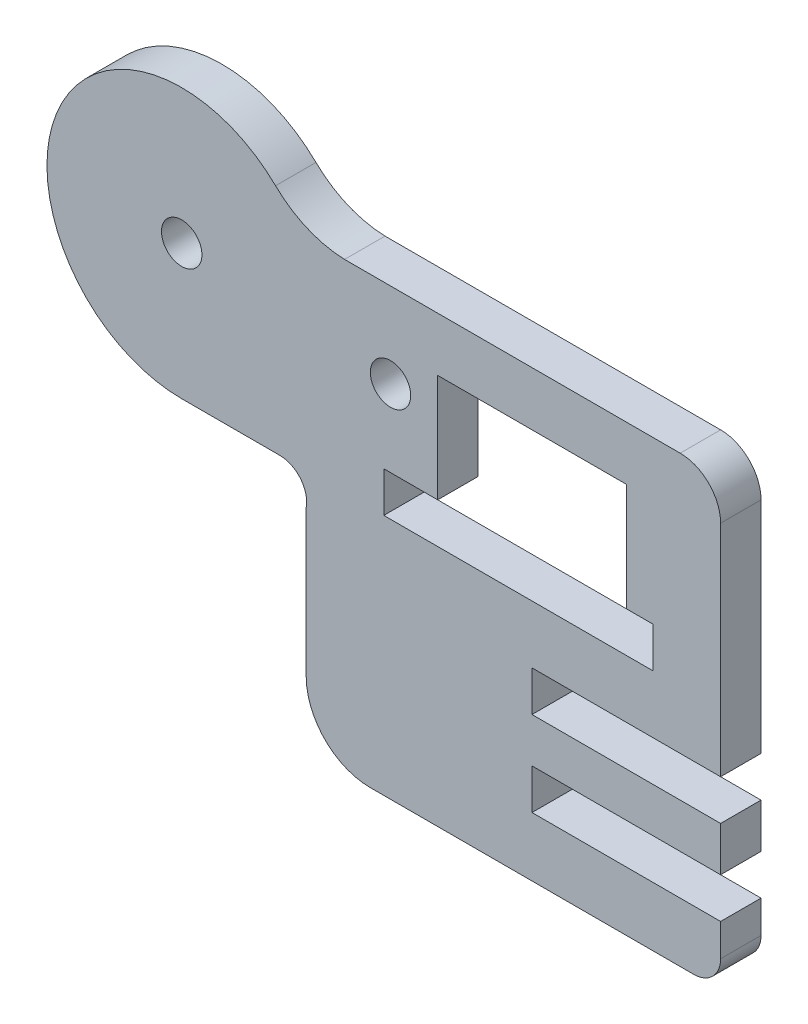
ISO-10303-21;
HEADER;
FILE_DESCRIPTION(('STEP AP214'),'2;1');
FILE_NAME('part.step','',(''),(''),'','','');
FILE_SCHEMA(('AUTOMOTIVE_DESIGN { 1 0 10303 214 1 1 1 1 }'));
ENDSEC;
DATA;
#1=APPLICATION_CONTEXT('core data for automotive mechanical design processes');
#2=APPLICATION_PROTOCOL_DEFINITION('international standard','automotive_design',2000,#1);
#3=PRODUCT_CONTEXT('',#1,'mechanical');
#4=PRODUCT('Part','Part','',(#3));
#5=PRODUCT_RELATED_PRODUCT_CATEGORY('part','',(#4));
#6=PRODUCT_DEFINITION_FORMATION('','',#4);
#7=PRODUCT_DEFINITION_CONTEXT('part definition',#1,'design');
#8=PRODUCT_DEFINITION('design','',#6,#7);
#9=PRODUCT_DEFINITION_SHAPE('','',#8);
#10=(LENGTH_UNIT() NAMED_UNIT(*) SI_UNIT(.MILLI.,.METRE.));
#11=(NAMED_UNIT(*) PLANE_ANGLE_UNIT() SI_UNIT($,.RADIAN.));
#12=(NAMED_UNIT(*) SI_UNIT($,.STERADIAN.) SOLID_ANGLE_UNIT());
#13=UNCERTAINTY_MEASURE_WITH_UNIT(LENGTH_MEASURE(1.E-05),#10,'distance_accuracy_value','');
#14=(GEOMETRIC_REPRESENTATION_CONTEXT(3) GLOBAL_UNCERTAINTY_ASSIGNED_CONTEXT((#13)) GLOBAL_UNIT_ASSIGNED_CONTEXT((#10,
#11,#12)) REPRESENTATION_CONTEXT('',''));
#15=CARTESIAN_POINT('',(0.,0.,0.));
#16=DIRECTION('',(0.,0.,1.));
#17=DIRECTION('',(1.,0.,0.));
#18=AXIS2_PLACEMENT_3D('',#15,#16,#17);
#19=CARTESIAN_POINT('',(5.27058823529409,-8.66843192746516,0.));
#20=DIRECTION('',(0.,1.,0.));
#21=DIRECTION('',(0.,0.,1.));
#22=AXIS2_PLACEMENT_3D('',#19,#20,#21);
#23=PLANE('',#22);
#24=DIRECTION('',(-1.,0.,0.));
#25=VECTOR('',#24,1.);
#26=CARTESIAN_POINT('',(5.27058823529409,-8.66843192746516,3.));
#27=LINE('',#26,#25);
#28=CARTESIAN_POINT('',(5.27058823529409,-8.66843192746516,3.));
#29=VERTEX_POINT('',#28);
#30=CARTESIAN_POINT('',(3.27058823529409,-8.66843192746516,3.));
#31=VERTEX_POINT('',#30);
#32=EDGE_CURVE('E297',#29,#31,#27,.T.);
#33=ORIENTED_EDGE('',*,*,#32,.T.);
#34=DIRECTION('',(0.,0.,1.));
#35=VECTOR('',#34,1.);
#36=CARTESIAN_POINT('',(3.27058823529409,-8.66843192746516,0.));
#37=LINE('',#36,#35);
#38=CARTESIAN_POINT('',(3.27058823529409,-8.66843192746516,0.));
#39=VERTEX_POINT('',#38);
#40=EDGE_CURVE('E268',#39,#31,#37,.T.);
#41=ORIENTED_EDGE('',*,*,#40,.F.);
#42=DIRECTION('',(-1.,0.,0.));
#43=VECTOR('',#42,1.);
#44=CARTESIAN_POINT('',(5.27058823529409,-8.66843192746516,0.));
#45=LINE('',#44,#43);
#46=CARTESIAN_POINT('',(5.27058823529409,-8.66843192746516,0.));
#47=VERTEX_POINT('',#46);
#48=EDGE_CURVE('E251',#47,#39,#45,.T.);
#49=ORIENTED_EDGE('',*,*,#48,.F.);
#50=DIRECTION('',(0.,0.,1.));
#51=VECTOR('',#50,1.);
#52=CARTESIAN_POINT('',(5.27058823529409,-8.66843192746516,0.));
#53=LINE('',#52,#51);
#54=EDGE_CURVE('E292',#47,#29,#53,.T.);
#55=ORIENTED_EDGE('',*,*,#54,.T.);
#56=EDGE_LOOP('',(#33,#41,#49,#55));
#57=FACE_BOUND('',#56,.T.);
#58=ADVANCED_FACE('F44',(#57),#23,.F.);
#59=CARTESIAN_POINT('',(10.2705882352941,0.331568072534842,3.));
#60=DIRECTION('',(-1.,0.,0.));
#61=DIRECTION('',(0.,-1.,0.));
#62=AXIS2_PLACEMENT_3D('',#59,#60,#61);
#63=PLANE('',#62);
#64=DIRECTION('',(0.,1.,0.));
#65=VECTOR('',#64,1.);
#66=CARTESIAN_POINT('',(10.2705882352941,0.331568072534842,0.));
#67=LINE('',#66,#65);
#68=CARTESIAN_POINT('',(10.2705882352941,-22.2684319274652,0.));
#69=VERTEX_POINT('',#68);
#70=CARTESIAN_POINT('',(10.2705882352941,-18.9684319274652,0.));
#71=VERTEX_POINT('',#70);
#72=EDGE_CURVE('E463',#69,#71,#67,.T.);
#73=ORIENTED_EDGE('',*,*,#72,.T.);
#74=DIRECTION('',(0.,0.,1.));
#75=VECTOR('',#74,1.);
#76=CARTESIAN_POINT('',(10.2705882352941,-18.9684319274652,0.));
#77=LINE('',#76,#75);
#78=CARTESIAN_POINT('',(10.2705882352941,-18.9684319274652,3.));
#79=VERTEX_POINT('',#78);
#80=EDGE_CURVE('E331',#71,#79,#77,.T.);
#81=ORIENTED_EDGE('',*,*,#80,.T.);
#82=DIRECTION('',(0.,1.,0.));
#83=VECTOR('',#82,1.);
#84=CARTESIAN_POINT('',(10.2705882352941,0.331568072534842,3.));
#85=LINE('',#84,#83);
#86=CARTESIAN_POINT('',(10.2705882352941,-22.2684319274652,3.));
#87=VERTEX_POINT('',#86);
#88=EDGE_CURVE('E427',#87,#79,#85,.T.);
#89=ORIENTED_EDGE('',*,*,#88,.F.);
#90=DIRECTION('',(0.,0.,1.));
#91=VECTOR('',#90,1.);
#92=CARTESIAN_POINT('',(10.2705882352941,-22.2684319274652,0.));
#93=LINE('',#92,#91);
#94=EDGE_CURVE('E357',#69,#87,#93,.T.);
#95=ORIENTED_EDGE('',*,*,#94,.F.);
#96=EDGE_LOOP('',(#73,#81,#89,#95));
#97=FACE_BOUND('',#96,.T.);
#98=ADVANCED_FACE('F565',(#97),#63,.F.);
#99=CARTESIAN_POINT('',(10.2705882352941,-27.6684319274652,0.));
#100=VERTEX_POINT('',#99);
#101=CARTESIAN_POINT('',(10.2705882352941,-25.2684319274652,0.));
#102=VERTEX_POINT('',#101);
#103=EDGE_CURVE('E458',#100,#102,#67,.T.);
#104=ORIENTED_EDGE('',*,*,#103,.T.);
#105=DIRECTION('',(0.,0.,1.));
#106=VECTOR('',#105,1.);
#107=CARTESIAN_POINT('',(10.2705882352941,-25.2684319274652,0.));
#108=LINE('',#107,#106);
#109=CARTESIAN_POINT('',(10.2705882352941,-25.2684319274652,3.));
#110=VERTEX_POINT('',#109);
#111=EDGE_CURVE('E271',#102,#110,#108,.T.);
#112=ORIENTED_EDGE('',*,*,#111,.T.);
#113=CARTESIAN_POINT('',(10.2705882352941,-27.6684319274652,3.));
#114=VERTEX_POINT('',#113);
#115=EDGE_CURVE('E422',#114,#110,#85,.T.);
#116=ORIENTED_EDGE('',*,*,#115,.F.);
#117=DIRECTION('',(0.,0.,-1.));
#118=VECTOR('',#117,1.);
#119=CARTESIAN_POINT('',(10.2705882352941,-27.6684319274652,3.));
#120=LINE('',#119,#118);
#121=EDGE_CURVE('E487',#114,#100,#120,.T.);
#122=ORIENTED_EDGE('',*,*,#121,.T.);
#123=EDGE_LOOP('',(#104,#112,#116,#122));
#124=FACE_BOUND('',#123,.T.);
#125=ADVANCED_FACE('F601',(#124),#63,.F.);
#126=CARTESIAN_POINT('',(-29.7294117647059,-1.66843192746516,3.));
#127=DIRECTION('',(0.,0.,-1.));
#128=DIRECTION('',(-1.,0.,0.));
#129=AXIS2_PLACEMENT_3D('',#126,#127,#128);
#130=CYLINDRICAL_SURFACE('',#129,10.);
#131=CARTESIAN_POINT('',(-29.7294117647059,-1.66843192746516,0.));
#132=DIRECTION('',(0.,0.,1.));
#133=DIRECTION('',(1.,0.,0.));
#134=AXIS2_PLACEMENT_3D('',#131,#132,#133);
#135=CIRCLE('',#134,10.);
#136=CARTESIAN_POINT('',(-22.7619798517541,5.50477464549648,0.));
#137=VERTEX_POINT('',#136);
#138=CARTESIAN_POINT('',(-29.7294117647059,-11.6684319274652,0.));
#139=VERTEX_POINT('',#138);
#140=EDGE_CURVE('E395',#137,#139,#135,.T.);
#141=ORIENTED_EDGE('',*,*,#140,.T.);
#142=DIRECTION('',(0.,0.,-1.));
#143=VECTOR('',#142,1.);
#144=CARTESIAN_POINT('',(-29.7294117647059,-11.6684319274652,3.));
#145=LINE('',#144,#143);
#146=CARTESIAN_POINT('',(-29.7294117647059,-11.6684319274652,3.));
#147=VERTEX_POINT('',#146);
#148=EDGE_CURVE('E11',#147,#139,#145,.T.);
#149=ORIENTED_EDGE('',*,*,#148,.F.);
#150=CARTESIAN_POINT('',(-29.7294117647059,-1.66843192746516,3.));
#151=DIRECTION('',(0.,0.,1.));
#152=DIRECTION('',(-1.,0.,0.));
#153=AXIS2_PLACEMENT_3D('',#150,#151,#152);
#154=CIRCLE('',#153,10.);
#155=CARTESIAN_POINT('',(-22.7619798517541,5.50477464549648,3.));
#156=VERTEX_POINT('',#155);
#157=EDGE_CURVE('E399',#156,#147,#154,.T.);
#158=ORIENTED_EDGE('',*,*,#157,.F.);
#159=DIRECTION('',(0.,0.,-1.));
#160=VECTOR('',#159,1.);
#161=CARTESIAN_POINT('',(-22.7619798517541,5.50477464549648,3.));
#162=LINE('',#161,#160);
#163=EDGE_CURVE('E436',#156,#137,#162,.T.);
#164=ORIENTED_EDGE('',*,*,#163,.T.);
#165=EDGE_LOOP('',(#141,#149,#158,#164));
#166=FACE_BOUND('',#165,.T.);
#167=ADVANCED_FACE('F46',(#166),#130,.T.);
#168=CARTESIAN_POINT('',(-29.7294117647059,-11.6684319274652,3.));
#169=DIRECTION('',(0.,1.,0.));
#170=DIRECTION('',(0.,0.,1.));
#171=AXIS2_PLACEMENT_3D('',#168,#169,#170);
#172=PLANE('',#171);
#173=DIRECTION('',(1.,0.,0.));
#174=VECTOR('',#173,1.);
#175=CARTESIAN_POINT('',(-29.7294117647059,-11.6684319274652,0.));
#176=LINE('',#175,#174);
#177=CARTESIAN_POINT('',(-22.4539096912314,-11.6684319274652,0.));
#178=VERTEX_POINT('',#177);
#179=EDGE_CURVE('E439',#139,#178,#176,.T.);
#180=ORIENTED_EDGE('',*,*,#179,.T.);
#181=DIRECTION('',(0.,0.,-1.));
#182=VECTOR('',#181,1.);
#183=CARTESIAN_POINT('',(-22.4539096912314,-11.6684319274652,3.));
#184=LINE('',#183,#182);
#185=CARTESIAN_POINT('',(-22.4539096912314,-11.6684319274652,3.));
#186=VERTEX_POINT('',#185);
#187=EDGE_CURVE('E53',#186,#178,#184,.T.);
#188=ORIENTED_EDGE('',*,*,#187,.F.);
#189=DIRECTION('',(1.,0.,0.));
#190=VECTOR('',#189,1.);
#191=CARTESIAN_POINT('',(-29.7294117647059,-11.6684319274652,3.));
#192=LINE('',#191,#190);
#193=EDGE_CURVE('E402',#147,#186,#192,.T.);
#194=ORIENTED_EDGE('',*,*,#193,.F.);
#195=ORIENTED_EDGE('',*,*,#148,.T.);
#196=EDGE_LOOP('',(#180,#188,#194,#195));
#197=FACE_BOUND('',#196,.T.);
#198=ADVANCED_FACE('F536',(#197),#172,.F.);
#199=CARTESIAN_POINT('',(-22.4539096912314,-13.6684319274652,3.));
#200=DIRECTION('',(0.,0.,-1.));
#201=DIRECTION('',(-1.,0.,0.));
#202=AXIS2_PLACEMENT_3D('',#199,#200,#201);
#203=CYLINDRICAL_SURFACE('',#202,2.);
#204=CARTESIAN_POINT('',(-22.4539096912314,-13.6684319274652,0.));
#205=DIRECTION('',(0.,0.,-1.));
#206=DIRECTION('',(-1.,0.,0.));
#207=AXIS2_PLACEMENT_3D('',#204,#205,#206);
#208=CIRCLE('',#207,2.);
#209=CARTESIAN_POINT('',(-20.4875047634796,-14.0334684463413,0.));
#210=VERTEX_POINT('',#209);
#211=EDGE_CURVE('E442',#178,#210,#208,.T.);
#212=ORIENTED_EDGE('',*,*,#211,.T.);
#213=DIRECTION('',(0.,0.,-1.));
#214=VECTOR('',#213,1.);
#215=CARTESIAN_POINT('',(-20.4875047634796,-14.0334684463413,3.));
#216=LINE('',#215,#214);
#217=CARTESIAN_POINT('',(-20.4875047634796,-14.0334684463413,3.));
#218=VERTEX_POINT('',#217);
#219=EDGE_CURVE('E503',#218,#210,#216,.T.);
#220=ORIENTED_EDGE('',*,*,#219,.F.);
#221=CARTESIAN_POINT('',(-22.4539096912314,-13.6684319274652,3.));
#222=DIRECTION('',(0.,0.,-1.));
#223=DIRECTION('',(-1.,0.,0.));
#224=AXIS2_PLACEMENT_3D('',#221,#222,#223);
#225=CIRCLE('',#224,2.);
#226=EDGE_CURVE('E406',#186,#218,#225,.T.);
#227=ORIENTED_EDGE('',*,*,#226,.F.);
#228=ORIENTED_EDGE('',*,*,#187,.T.);
#229=EDGE_LOOP('',(#212,#220,#227,#228));
#230=FACE_BOUND('',#229,.T.);
#231=ADVANCED_FACE('F512',(#230),#203,.F.);
#232=CARTESIAN_POINT('',(-20.4875047634796,-24.9103389286915,3.));
#233=DIRECTION('',(1.,0.,0.));
#234=DIRECTION('',(0.,0.,-1.));
#235=AXIS2_PLACEMENT_3D('',#232,#233,#234);
#236=PLANE('',#235);
#237=DIRECTION('',(0.,-1.,0.));
#238=VECTOR('',#237,1.);
#239=CARTESIAN_POINT('',(-20.4875047634796,-24.9103389286915,0.));
#240=LINE('',#239,#238);
#241=CARTESIAN_POINT('',(-20.4875047634796,-24.9103389286915,0.));
#242=VERTEX_POINT('',#241);
#243=EDGE_CURVE('E445',#210,#242,#240,.T.);
#244=ORIENTED_EDGE('',*,*,#243,.T.);
#245=DIRECTION('',(0.,0.,-1.));
#246=VECTOR('',#245,1.);
#247=CARTESIAN_POINT('',(-20.4875047634796,-24.9103389286915,3.));
#248=LINE('',#247,#246);
#249=CARTESIAN_POINT('',(-20.4875047634796,-24.9103389286915,3.));
#250=VERTEX_POINT('',#249);
#251=EDGE_CURVE('E499',#250,#242,#248,.T.);
#252=ORIENTED_EDGE('',*,*,#251,.F.);
#253=DIRECTION('',(0.,-1.,0.));
#254=VECTOR('',#253,1.);
#255=CARTESIAN_POINT('',(-20.4875047634796,-24.9103389286915,3.));
#256=LINE('',#255,#254);
#257=EDGE_CURVE('E409',#218,#250,#256,.T.);
#258=ORIENTED_EDGE('',*,*,#257,.F.);
#259=ORIENTED_EDGE('',*,*,#219,.T.);
#260=EDGE_LOOP('',(#244,#252,#258,#259));
#261=FACE_BOUND('',#260,.T.);
#262=ADVANCED_FACE('F523',(#261),#236,.F.);
#263=CARTESIAN_POINT('',(-15.7294117647059,-24.9103389286915,3.));
#264=DIRECTION('',(0.,0.,-1.));
#265=DIRECTION('',(-1.,0.,0.));
#266=AXIS2_PLACEMENT_3D('',#263,#264,#265);
#267=CYLINDRICAL_SURFACE('',#266,4.75809299877365);
#268=CARTESIAN_POINT('',(-15.7294117647059,-24.9103389286915,0.));
#269=DIRECTION('',(0.,0.,1.));
#270=DIRECTION('',(1.,0.,0.));
#271=AXIS2_PLACEMENT_3D('',#268,#269,#270);
#272=CIRCLE('',#271,4.75809299877365);
#273=CARTESIAN_POINT('',(-15.7294117647059,-29.6684319274652,0.));
#274=VERTEX_POINT('',#273);
#275=EDGE_CURVE('E448',#242,#274,#272,.T.);
#276=ORIENTED_EDGE('',*,*,#275,.T.);
#277=DIRECTION('',(0.,0.,-1.));
#278=VECTOR('',#277,1.);
#279=CARTESIAN_POINT('',(-15.7294117647059,-29.6684319274652,3.));
#280=LINE('',#279,#278);
#281=CARTESIAN_POINT('',(-15.7294117647059,-29.6684319274652,3.));
#282=VERTEX_POINT('',#281);
#283=EDGE_CURVE('E495',#282,#274,#280,.T.);
#284=ORIENTED_EDGE('',*,*,#283,.F.);
#285=CARTESIAN_POINT('',(-15.7294117647059,-24.9103389286915,3.));
#286=DIRECTION('',(0.,0.,1.));
#287=DIRECTION('',(1.,0.,0.));
#288=AXIS2_PLACEMENT_3D('',#285,#286,#287);
#289=CIRCLE('',#288,4.75809299877365);
#290=EDGE_CURVE('E412',#250,#282,#289,.T.);
#291=ORIENTED_EDGE('',*,*,#290,.F.);
#292=ORIENTED_EDGE('',*,*,#251,.T.);
#293=EDGE_LOOP('',(#276,#284,#291,#292));
#294=FACE_BOUND('',#293,.T.);
#295=ADVANCED_FACE('F527',(#294),#267,.T.);
#296=CARTESIAN_POINT('',(8.27058823529409,-29.6684319274652,3.));
#297=DIRECTION('',(0.,1.,0.));
#298=DIRECTION('',(-1.,0.,0.));
#299=AXIS2_PLACEMENT_3D('',#296,#297,#298);
#300=PLANE('',#299);
#301=DIRECTION('',(1.,0.,0.));
#302=VECTOR('',#301,1.);
#303=CARTESIAN_POINT('',(8.27058823529409,-29.6684319274652,0.));
#304=LINE('',#303,#302);
#305=CARTESIAN_POINT('',(8.27058823529409,-29.6684319274652,0.));
#306=VERTEX_POINT('',#305);
#307=EDGE_CURVE('E451',#274,#306,#304,.T.);
#308=ORIENTED_EDGE('',*,*,#307,.T.);
#309=DIRECTION('',(0.,0.,-1.));
#310=VECTOR('',#309,1.);
#311=CARTESIAN_POINT('',(8.27058823529409,-29.6684319274652,3.));
#312=LINE('',#311,#310);
#313=CARTESIAN_POINT('',(8.27058823529409,-29.6684319274652,3.));
#314=VERTEX_POINT('',#313);
#315=EDGE_CURVE('E491',#314,#306,#312,.T.);
#316=ORIENTED_EDGE('',*,*,#315,.F.);
#317=DIRECTION('',(1.,0.,0.));
#318=VECTOR('',#317,1.);
#319=CARTESIAN_POINT('',(8.27058823529409,-29.6684319274652,3.));
#320=LINE('',#319,#318);
#321=EDGE_CURVE('E415',#282,#314,#320,.T.);
#322=ORIENTED_EDGE('',*,*,#321,.F.);
#323=ORIENTED_EDGE('',*,*,#283,.T.);
#324=EDGE_LOOP('',(#308,#316,#322,#323));
#325=FACE_BOUND('',#324,.T.);
#326=ADVANCED_FACE('F676',(#325),#300,.F.);
#327=CARTESIAN_POINT('',(8.27058823529409,-27.6684319274652,3.));
#328=DIRECTION('',(0.,0.,-1.));
#329=DIRECTION('',(-1.,0.,0.));
#330=AXIS2_PLACEMENT_3D('',#327,#328,#329);
#331=CYLINDRICAL_SURFACE('',#330,2.);
#332=CARTESIAN_POINT('',(8.27058823529409,-27.6684319274652,0.));
#333=DIRECTION('',(0.,0.,1.));
#334=DIRECTION('',(-1.,0.,0.));
#335=AXIS2_PLACEMENT_3D('',#332,#333,#334);
#336=CIRCLE('',#335,2.);
#337=EDGE_CURVE('E454',#306,#100,#336,.T.);
#338=ORIENTED_EDGE('',*,*,#337,.T.);
#339=ORIENTED_EDGE('',*,*,#121,.F.);
#340=CARTESIAN_POINT('',(8.27058823529409,-27.6684319274652,3.));
#341=DIRECTION('',(0.,0.,1.));
#342=DIRECTION('',(-1.,0.,0.));
#343=AXIS2_PLACEMENT_3D('',#340,#341,#342);
#344=CIRCLE('',#343,2.);
#345=EDGE_CURVE('E418',#314,#114,#344,.T.);
#346=ORIENTED_EDGE('',*,*,#345,.F.);
#347=ORIENTED_EDGE('',*,*,#315,.T.);
#348=EDGE_LOOP('',(#338,#339,#346,#347));
#349=FACE_BOUND('',#348,.T.);
#350=ADVANCED_FACE('F673',(#349),#331,.T.);
#351=CARTESIAN_POINT('',(10.2705882352941,-15.9684319274652,3.));
#352=VERTEX_POINT('',#351);
#353=CARTESIAN_POINT('',(10.2705882352941,0.331568072534842,3.));
#354=VERTEX_POINT('',#353);
#355=EDGE_CURVE('E421',#352,#354,#85,.T.);
#356=ORIENTED_EDGE('',*,*,#355,.F.);
#357=DIRECTION('',(0.,0.,1.));
#358=VECTOR('',#357,1.);
#359=CARTESIAN_POINT('',(10.2705882352941,-15.9684319274652,0.));
#360=LINE('',#359,#358);
#361=CARTESIAN_POINT('',(10.2705882352941,-15.9684319274652,0.));
#362=VERTEX_POINT('',#361);
#363=EDGE_CURVE('E321',#362,#352,#360,.T.);
#364=ORIENTED_EDGE('',*,*,#363,.F.);
#365=CARTESIAN_POINT('',(10.2705882352941,0.331568072534842,0.));
#366=VERTEX_POINT('',#365);
#367=EDGE_CURVE('E457',#362,#366,#67,.T.);
#368=ORIENTED_EDGE('',*,*,#367,.T.);
#369=DIRECTION('',(0.,0.,-1.));
#370=VECTOR('',#369,1.);
#371=CARTESIAN_POINT('',(10.2705882352941,0.331568072534842,3.));
#372=LINE('',#371,#370);
#373=EDGE_CURVE('E483',#354,#366,#372,.T.);
#374=ORIENTED_EDGE('',*,*,#373,.F.);
#375=EDGE_LOOP('',(#356,#364,#368,#374));
#376=FACE_BOUND('',#375,.T.);
#377=ADVANCED_FACE('F557',(#376),#63,.F.);
#378=CARTESIAN_POINT('',(7.27058823529408,0.331568072534842,3.));
#379=DIRECTION('',(0.,0.,-1.));
#380=DIRECTION('',(-1.,0.,0.));
#381=AXIS2_PLACEMENT_3D('',#378,#379,#380);
#382=CYLINDRICAL_SURFACE('',#381,3.);
#383=CARTESIAN_POINT('',(7.27058823529408,0.331568072534842,0.));
#384=DIRECTION('',(0.,0.,1.));
#385=DIRECTION('',(-1.,0.,0.));
#386=AXIS2_PLACEMENT_3D('',#383,#384,#385);
#387=CIRCLE('',#386,3.);
#388=CARTESIAN_POINT('',(7.27058823529408,3.33156807253484,0.));
#389=VERTEX_POINT('',#388);
#390=EDGE_CURVE('E462',#366,#389,#387,.T.);
#391=ORIENTED_EDGE('',*,*,#390,.T.);
#392=DIRECTION('',(0.,0.,-1.));
#393=VECTOR('',#392,1.);
#394=CARTESIAN_POINT('',(7.27058823529408,3.33156807253484,3.));
#395=LINE('',#394,#393);
#396=CARTESIAN_POINT('',(7.27058823529408,3.33156807253484,3.));
#397=VERTEX_POINT('',#396);
#398=EDGE_CURVE('E479',#397,#389,#395,.T.);
#399=ORIENTED_EDGE('',*,*,#398,.F.);
#400=CARTESIAN_POINT('',(7.27058823529408,0.331568072534842,3.));
#401=DIRECTION('',(0.,0.,1.));
#402=DIRECTION('',(-1.,0.,0.));
#403=AXIS2_PLACEMENT_3D('',#400,#401,#402);
#404=CIRCLE('',#403,3.);
#405=EDGE_CURVE('E426',#354,#397,#404,.T.);
#406=ORIENTED_EDGE('',*,*,#405,.F.);
#407=ORIENTED_EDGE('',*,*,#373,.T.);
#408=EDGE_LOOP('',(#391,#399,#406,#407));
#409=FACE_BOUND('',#408,.T.);
#410=ADVANCED_FACE('F552',(#409),#382,.T.);
#411=CARTESIAN_POINT('',(-17.6384186996634,3.33156807253484,3.));
#412=DIRECTION('',(0.,-1.,0.));
#413=DIRECTION('',(0.,0.,-1.));
#414=AXIS2_PLACEMENT_3D('',#411,#412,#413);
#415=PLANE('',#414);
#416=DIRECTION('',(-1.,0.,0.));
#417=VECTOR('',#416,1.);
#418=CARTESIAN_POINT('',(-17.6384186996634,3.33156807253484,0.));
#419=LINE('',#418,#417);
#420=CARTESIAN_POINT('',(-17.6384186996634,3.33156807253484,0.));
#421=VERTEX_POINT('',#420);
#422=EDGE_CURVE('E466',#389,#421,#419,.T.);
#423=ORIENTED_EDGE('',*,*,#422,.T.);
#424=DIRECTION('',(0.,0.,-1.));
#425=VECTOR('',#424,1.);
#426=CARTESIAN_POINT('',(-17.6384186996634,3.33156807253484,3.));
#427=LINE('',#426,#425);
#428=CARTESIAN_POINT('',(-17.6384186996634,3.33156807253484,3.));
#429=VERTEX_POINT('',#428);
#430=EDGE_CURVE('E475',#429,#421,#427,.T.);
#431=ORIENTED_EDGE('',*,*,#430,.F.);
#432=DIRECTION('',(-1.,0.,0.));
#433=VECTOR('',#432,1.);
#434=CARTESIAN_POINT('',(-17.6384186996634,3.33156807253484,3.));
#435=LINE('',#434,#433);
#436=EDGE_CURVE('E430',#397,#429,#435,.T.);
#437=ORIENTED_EDGE('',*,*,#436,.F.);
#438=ORIENTED_EDGE('',*,*,#398,.T.);
#439=EDGE_LOOP('',(#423,#431,#437,#438));
#440=FACE_BOUND('',#439,.T.);
#441=ADVANCED_FACE('F547',(#440),#415,.F.);
#442=CARTESIAN_POINT('',(-17.3960989456653,11.0291303430002,3.));
#443=DIRECTION('',(0.,0.,-1.));
#444=DIRECTION('',(-1.,0.,0.));
#445=AXIS2_PLACEMENT_3D('',#442,#443,#444);
#446=CYLINDRICAL_SURFACE('',#445,7.70137544668938);
#447=CARTESIAN_POINT('',(-17.3960989456653,11.0291303430002,0.));
#448=DIRECTION('',(0.,0.,-1.));
#449=DIRECTION('',(1.,0.,0.));
#450=AXIS2_PLACEMENT_3D('',#447,#448,#449);
#451=CIRCLE('',#450,7.70137544668938);
#452=EDGE_CURVE('E403',#421,#137,#451,.T.);
#453=ORIENTED_EDGE('',*,*,#452,.T.);
#454=ORIENTED_EDGE('',*,*,#163,.F.);
#455=CARTESIAN_POINT('',(-17.3960989456653,11.0291303430002,3.));
#456=DIRECTION('',(0.,0.,-1.));
#457=DIRECTION('',(1.,0.,0.));
#458=AXIS2_PLACEMENT_3D('',#455,#456,#457);
#459=CIRCLE('',#458,7.70137544668938);
#460=EDGE_CURVE('E433',#429,#156,#459,.T.);
#461=ORIENTED_EDGE('',*,*,#460,.F.);
#462=ORIENTED_EDGE('',*,*,#430,.T.);
#463=EDGE_LOOP('',(#453,#454,#461,#462));
#464=FACE_BOUND('',#463,.T.);
#465=ADVANCED_FACE('F542',(#464),#446,.F.);
#466=CARTESIAN_POINT('',(-29.7294117647059,-1.66843192746516,3.));
#467=DIRECTION('',(0.,0.,-1.));
#468=DIRECTION('',(-1.,0.,0.));
#469=AXIS2_PLACEMENT_3D('',#466,#467,#468);
#470=PLANE('',#469);
#471=CARTESIAN_POINT('',(-14.2294117647059,-2.96843192746516,3.));
#472=DIRECTION('',(0.,0.,1.));
#473=DIRECTION('',(1.,0.,0.));
#474=AXIS2_PLACEMENT_3D('',#471,#472,#473);
#475=CIRCLE('',#474,1.5);
#476=CARTESIAN_POINT('',(-12.7294117647059,-2.96843192746516,3.));
#477=VERTEX_POINT('',#476);
#478=EDGE_CURVE('E258',#477,#477,#475,.T.);
#479=ORIENTED_EDGE('',*,*,#478,.F.);
#480=EDGE_LOOP('',(#479));
#481=FACE_BOUND('',#480,.T.);
#482=DIRECTION('',(-1.,0.,0.));
#483=VECTOR('',#482,1.);
#484=CARTESIAN_POINT('',(3.27058823529409,-0.668431927465168,3.));
#485=LINE('',#484,#483);
#486=CARTESIAN_POINT('',(3.27058823529409,-0.668431927465168,3.));
#487=VERTEX_POINT('',#486);
#488=CARTESIAN_POINT('',(-10.7294117647059,-0.668431927465169,3.));
#489=VERTEX_POINT('',#488);
#490=EDGE_CURVE('E255',#487,#489,#485,.T.);
#491=ORIENTED_EDGE('',*,*,#490,.F.);
#492=DIRECTION('',(0.,1.,0.));
#493=VECTOR('',#492,1.);
#494=CARTESIAN_POINT('',(3.27058823529409,-8.66843192746516,3.));
#495=LINE('',#494,#493);
#496=EDGE_CURVE('E230',#31,#487,#495,.T.);
#497=ORIENTED_EDGE('',*,*,#496,.F.);
#498=ORIENTED_EDGE('',*,*,#32,.F.);
#499=DIRECTION('',(0.,1.,0.));
#500=VECTOR('',#499,1.);
#501=CARTESIAN_POINT('',(5.27058823529409,-11.6684319274652,3.));
#502=LINE('',#501,#500);
#503=CARTESIAN_POINT('',(5.27058823529409,-11.6684319274652,3.));
#504=VERTEX_POINT('',#503);
#505=EDGE_CURVE('E68',#504,#29,#502,.T.);
#506=ORIENTED_EDGE('',*,*,#505,.F.);
#507=DIRECTION('',(1.,0.,0.));
#508=VECTOR('',#507,1.);
#509=CARTESIAN_POINT('',(5.27058823529409,-11.6684319274652,3.));
#510=LINE('',#509,#508);
#511=CARTESIAN_POINT('',(-14.7294117647059,-11.6684319274652,3.));
#512=VERTEX_POINT('',#511);
#513=EDGE_CURVE('E281',#512,#504,#510,.T.);
#514=ORIENTED_EDGE('',*,*,#513,.F.);
#515=DIRECTION('',(0.,-1.,0.));
#516=VECTOR('',#515,1.);
#517=CARTESIAN_POINT('',(-14.7294117647059,-11.6684319274652,3.));
#518=LINE('',#517,#516);
#519=CARTESIAN_POINT('',(-14.7294117647059,-8.66843192746516,3.));
#520=VERTEX_POINT('',#519);
#521=EDGE_CURVE('E301',#520,#512,#518,.T.);
#522=ORIENTED_EDGE('',*,*,#521,.F.);
#523=CARTESIAN_POINT('',(-10.7294117647059,-8.66843192746516,3.));
#524=VERTEX_POINT('',#523);
#525=EDGE_CURVE('E295',#524,#520,#27,.T.);
#526=ORIENTED_EDGE('',*,*,#525,.F.);
#527=DIRECTION('',(0.,-1.,0.));
#528=VECTOR('',#527,1.);
#529=CARTESIAN_POINT('',(-10.7294117647059,-8.66843192746516,3.));
#530=LINE('',#529,#528);
#531=EDGE_CURVE('E60',#489,#524,#530,.T.);
#532=ORIENTED_EDGE('',*,*,#531,.F.);
#533=EDGE_LOOP('',(#491,#497,#498,#506,#514,#522,#526,#532));
#534=FACE_BOUND('',#533,.T.);
#535=CARTESIAN_POINT('',(-29.7294117647059,-1.66843192746516,3.));
#536=DIRECTION('',(0.,0.,1.));
#537=DIRECTION('',(1.,0.,0.));
#538=AXIS2_PLACEMENT_3D('',#535,#536,#537);
#539=CIRCLE('',#538,1.5);
#540=CARTESIAN_POINT('',(-28.2294117647059,-1.66843192746516,3.));
#541=VERTEX_POINT('',#540);
#542=EDGE_CURVE('E311',#541,#541,#539,.T.);
#543=ORIENTED_EDGE('',*,*,#542,.F.);
#544=EDGE_LOOP('',(#543));
#545=FACE_BOUND('',#544,.T.);
#546=ORIENTED_EDGE('',*,*,#88,.T.);
#547=DIRECTION('',(1.,0.,0.));
#548=VECTOR('',#547,1.);
#549=CARTESIAN_POINT('',(-3.72941176470591,-18.9684319274652,3.));
#550=LINE('',#549,#548);
#551=CARTESIAN_POINT('',(-3.72941176470591,-18.9684319274652,3.));
#552=VERTEX_POINT('',#551);
#553=EDGE_CURVE('E336',#552,#79,#550,.T.);
#554=ORIENTED_EDGE('',*,*,#553,.F.);
#555=DIRECTION('',(0.,-1.,0.));
#556=VECTOR('',#555,1.);
#557=CARTESIAN_POINT('',(-3.72941176470591,-15.9684319274652,3.));
#558=LINE('',#557,#556);
#559=CARTESIAN_POINT('',(-3.72941176470591,-15.9684319274652,3.));
#560=VERTEX_POINT('',#559);
#561=EDGE_CURVE('E339',#560,#552,#558,.T.);
#562=ORIENTED_EDGE('',*,*,#561,.F.);
#563=DIRECTION('',(-1.,0.,0.));
#564=VECTOR('',#563,1.);
#565=CARTESIAN_POINT('',(10.2705882352941,-15.9684319274652,3.));
#566=LINE('',#565,#564);
#567=EDGE_CURVE('E296',#352,#560,#566,.T.);
#568=ORIENTED_EDGE('',*,*,#567,.F.);
#569=ORIENTED_EDGE('',*,*,#355,.T.);
#570=ORIENTED_EDGE('',*,*,#405,.T.);
#571=ORIENTED_EDGE('',*,*,#436,.T.);
#572=ORIENTED_EDGE('',*,*,#460,.T.);
#573=ORIENTED_EDGE('',*,*,#157,.T.);
#574=ORIENTED_EDGE('',*,*,#193,.T.);
#575=ORIENTED_EDGE('',*,*,#226,.T.);
#576=ORIENTED_EDGE('',*,*,#257,.T.);
#577=ORIENTED_EDGE('',*,*,#290,.T.);
#578=ORIENTED_EDGE('',*,*,#321,.T.);
#579=ORIENTED_EDGE('',*,*,#345,.T.);
#580=ORIENTED_EDGE('',*,*,#115,.T.);
#581=DIRECTION('',(1.,0.,0.));
#582=VECTOR('',#581,1.);
#583=CARTESIAN_POINT('',(10.2705882352941,-25.2684319274652,3.));
#584=LINE('',#583,#582);
#585=CARTESIAN_POINT('',(-3.72941176470591,-25.2684319274652,3.));
#586=VERTEX_POINT('',#585);
#587=EDGE_CURVE('E370',#586,#110,#584,.T.);
#588=ORIENTED_EDGE('',*,*,#587,.F.);
#589=DIRECTION('',(0.,-1.,0.));
#590=VECTOR('',#589,1.);
#591=CARTESIAN_POINT('',(-3.72941176470591,-22.2684319274652,3.));
#592=LINE('',#591,#590);
#593=CARTESIAN_POINT('',(-3.72941176470591,-22.2684319274652,3.));
#594=VERTEX_POINT('',#593);
#595=EDGE_CURVE('E373',#594,#586,#592,.T.);
#596=ORIENTED_EDGE('',*,*,#595,.F.);
#597=DIRECTION('',(-1.,0.,0.));
#598=VECTOR('',#597,1.);
#599=CARTESIAN_POINT('',(10.2705882352941,-22.2684319274652,3.));
#600=LINE('',#599,#598);
#601=EDGE_CURVE('E335',#87,#594,#600,.T.);
#602=ORIENTED_EDGE('',*,*,#601,.F.);
#603=EDGE_LOOP('',(#546,#554,#562,#568,#569,#570,#571,#572,#573,#574,#575,#576,#577,#578,#579,
#580,#588,#596,#602));
#604=FACE_BOUND('',#603,.T.);
#605=ADVANCED_FACE('F532',(#481,#534,#545,#604),#470,.F.);
#606=CARTESIAN_POINT('',(-29.7294117647059,-1.66843192746516,0.));
#607=DIRECTION('',(0.,0.,-1.));
#608=DIRECTION('',(-1.,0.,0.));
#609=AXIS2_PLACEMENT_3D('',#606,#607,#608);
#610=PLANE('',#609);
#611=CARTESIAN_POINT('',(-14.2294117647059,-2.96843192746516,0.));
#612=DIRECTION('',(0.,0.,1.));
#613=DIRECTION('',(1.,0.,0.));
#614=AXIS2_PLACEMENT_3D('',#611,#612,#613);
#615=CIRCLE('',#614,1.5);
#616=CARTESIAN_POINT('',(-12.7294117647059,-2.96843192746516,0.));
#617=VERTEX_POINT('',#616);
#618=EDGE_CURVE('E265',#617,#617,#615,.T.);
#619=ORIENTED_EDGE('',*,*,#618,.T.);
#620=EDGE_LOOP('',(#619));
#621=FACE_BOUND('',#620,.T.);
#622=DIRECTION('',(0.,1.,0.));
#623=VECTOR('',#622,1.);
#624=CARTESIAN_POINT('',(3.27058823529409,-8.66843192746516,0.));
#625=LINE('',#624,#623);
#626=CARTESIAN_POINT('',(3.27058823529409,-0.668431927465168,0.));
#627=VERTEX_POINT('',#626);
#628=EDGE_CURVE('E227',#39,#627,#625,.T.);
#629=ORIENTED_EDGE('',*,*,#628,.T.);
#630=DIRECTION('',(-1.,0.,0.));
#631=VECTOR('',#630,1.);
#632=CARTESIAN_POINT('',(3.27058823529409,-0.668431927465168,0.));
#633=LINE('',#632,#631);
#634=CARTESIAN_POINT('',(-10.7294117647059,-0.668431927465169,0.));
#635=VERTEX_POINT('',#634);
#636=EDGE_CURVE('E239',#627,#635,#633,.T.);
#637=ORIENTED_EDGE('',*,*,#636,.T.);
#638=DIRECTION('',(0.,-1.,0.));
#639=VECTOR('',#638,1.);
#640=CARTESIAN_POINT('',(-10.7294117647059,-8.66843192746516,0.));
#641=LINE('',#640,#639);
#642=CARTESIAN_POINT('',(-10.7294117647059,-8.66843192746516,0.));
#643=VERTEX_POINT('',#642);
#644=EDGE_CURVE('E236',#635,#643,#641,.T.);
#645=ORIENTED_EDGE('',*,*,#644,.T.);
#646=CARTESIAN_POINT('',(-14.7294117647059,-8.66843192746516,0.));
#647=VERTEX_POINT('',#646);
#648=EDGE_CURVE('E280',#643,#647,#45,.T.);
#649=ORIENTED_EDGE('',*,*,#648,.T.);
#650=DIRECTION('',(0.,-1.,0.));
#651=VECTOR('',#650,1.);
#652=CARTESIAN_POINT('',(-14.7294117647059,-11.6684319274652,0.));
#653=LINE('',#652,#651);
#654=CARTESIAN_POINT('',(-14.7294117647059,-11.6684319274652,0.));
#655=VERTEX_POINT('',#654);
#656=EDGE_CURVE('E284',#647,#655,#653,.T.);
#657=ORIENTED_EDGE('',*,*,#656,.T.);
#658=DIRECTION('',(1.,0.,0.));
#659=VECTOR('',#658,1.);
#660=CARTESIAN_POINT('',(5.27058823529409,-11.6684319274652,0.));
#661=LINE('',#660,#659);
#662=CARTESIAN_POINT('',(5.27058823529409,-11.6684319274652,0.));
#663=VERTEX_POINT('',#662);
#664=EDGE_CURVE('E288',#655,#663,#661,.T.);
#665=ORIENTED_EDGE('',*,*,#664,.T.);
#666=DIRECTION('',(0.,1.,0.));
#667=VECTOR('',#666,1.);
#668=CARTESIAN_POINT('',(5.27058823529409,-11.6684319274652,0.));
#669=LINE('',#668,#667);
#670=EDGE_CURVE('E277',#663,#47,#669,.T.);
#671=ORIENTED_EDGE('',*,*,#670,.T.);
#672=ORIENTED_EDGE('',*,*,#48,.T.);
#673=EDGE_LOOP('',(#629,#637,#645,#649,#657,#665,#671,#672));
#674=FACE_BOUND('',#673,.T.);
#675=DIRECTION('',(1.,0.,0.));
#676=VECTOR('',#675,1.);
#677=CARTESIAN_POINT('',(-3.72941176470591,-18.9684319274652,0.));
#678=LINE('',#677,#676);
#679=CARTESIAN_POINT('',(-3.72941176470591,-18.9684319274652,0.));
#680=VERTEX_POINT('',#679);
#681=EDGE_CURVE('E324',#680,#71,#678,.T.);
#682=ORIENTED_EDGE('',*,*,#681,.T.);
#683=ORIENTED_EDGE('',*,*,#72,.F.);
#684=DIRECTION('',(-1.,0.,0.));
#685=VECTOR('',#684,1.);
#686=CARTESIAN_POINT('',(10.2705882352941,-22.2684319274652,0.));
#687=LINE('',#686,#685);
#688=CARTESIAN_POINT('',(-3.72941176470591,-22.2684319274652,0.));
#689=VERTEX_POINT('',#688);
#690=EDGE_CURVE('E374',#69,#689,#687,.T.);
#691=ORIENTED_EDGE('',*,*,#690,.T.);
#692=DIRECTION('',(0.,-1.,0.));
#693=VECTOR('',#692,1.);
#694=CARTESIAN_POINT('',(-3.72941176470591,-22.2684319274652,0.));
#695=LINE('',#694,#693);
#696=CARTESIAN_POINT('',(-3.72941176470591,-25.2684319274652,0.));
#697=VERTEX_POINT('',#696);
#698=EDGE_CURVE('E384',#689,#697,#695,.T.);
#699=ORIENTED_EDGE('',*,*,#698,.T.);
#700=DIRECTION('',(1.,0.,0.));
#701=VECTOR('',#700,1.);
#702=CARTESIAN_POINT('',(10.2705882352941,-25.2684319274652,0.));
#703=LINE('',#702,#701);
#704=EDGE_CURVE('E360',#697,#102,#703,.T.);
#705=ORIENTED_EDGE('',*,*,#704,.T.);
#706=ORIENTED_EDGE('',*,*,#103,.F.);
#707=ORIENTED_EDGE('',*,*,#337,.F.);
#708=ORIENTED_EDGE('',*,*,#307,.F.);
#709=ORIENTED_EDGE('',*,*,#275,.F.);
#710=ORIENTED_EDGE('',*,*,#243,.F.);
#711=ORIENTED_EDGE('',*,*,#211,.F.);
#712=ORIENTED_EDGE('',*,*,#179,.F.);
#713=ORIENTED_EDGE('',*,*,#140,.F.);
#714=ORIENTED_EDGE('',*,*,#452,.F.);
#715=ORIENTED_EDGE('',*,*,#422,.F.);
#716=ORIENTED_EDGE('',*,*,#390,.F.);
#717=ORIENTED_EDGE('',*,*,#367,.F.);
#718=DIRECTION('',(-1.,0.,0.));
#719=VECTOR('',#718,1.);
#720=CARTESIAN_POINT('',(10.2705882352941,-15.9684319274652,0.));
#721=LINE('',#720,#719);
#722=CARTESIAN_POINT('',(-3.72941176470591,-15.9684319274652,0.));
#723=VERTEX_POINT('',#722);
#724=EDGE_CURVE('E340',#362,#723,#721,.T.);
#725=ORIENTED_EDGE('',*,*,#724,.T.);
#726=DIRECTION('',(0.,-1.,0.));
#727=VECTOR('',#726,1.);
#728=CARTESIAN_POINT('',(-3.72941176470591,-15.9684319274652,0.));
#729=LINE('',#728,#727);
#730=EDGE_CURVE('E350',#723,#680,#729,.T.);
#731=ORIENTED_EDGE('',*,*,#730,.T.);
#732=EDGE_LOOP('',(#682,#683,#691,#699,#705,#706,#707,#708,#709,#710,#711,#712,#713,#714,#715,
#716,#717,#725,#731));
#733=FACE_BOUND('',#732,.T.);
#734=CARTESIAN_POINT('',(-29.7294117647059,-1.66843192746516,0.));
#735=DIRECTION('',(0.,0.,1.));
#736=DIRECTION('',(1.,0.,0.));
#737=AXIS2_PLACEMENT_3D('',#734,#735,#736);
#738=CIRCLE('',#737,1.5);
#739=CARTESIAN_POINT('',(-28.2294117647059,-1.66843192746516,0.));
#740=VERTEX_POINT('',#739);
#741=EDGE_CURVE('E391',#740,#740,#738,.T.);
#742=ORIENTED_EDGE('',*,*,#741,.T.);
#743=EDGE_LOOP('',(#742));
#744=FACE_BOUND('',#743,.T.);
#745=ADVANCED_FACE('F247',(#621,#674,#733,#744),#610,.T.);
#746=CARTESIAN_POINT('',(-29.7294117647059,-1.66843192746516,0.));
#747=DIRECTION('',(0.,0.,1.));
#748=DIRECTION('',(1.,0.,0.));
#749=AXIS2_PLACEMENT_3D('',#746,#747,#748);
#750=CYLINDRICAL_SURFACE('',#749,1.5);
#751=ORIENTED_EDGE('',*,*,#741,.F.);
#752=EDGE_LOOP('',(#751));
#753=FACE_BOUND('',#752,.T.);
#754=ORIENTED_EDGE('',*,*,#542,.T.);
#755=EDGE_LOOP('',(#754));
#756=FACE_BOUND('',#755,.T.);
#757=ADVANCED_FACE('F655',(#753,#756),#750,.F.);
#758=CARTESIAN_POINT('',(10.2705882352941,-25.2684319274652,0.));
#759=DIRECTION('',(0.,-1.,0.));
#760=DIRECTION('',(1.,0.,0.));
#761=AXIS2_PLACEMENT_3D('',#758,#759,#760);
#762=PLANE('',#761);
#763=ORIENTED_EDGE('',*,*,#587,.T.);
#764=ORIENTED_EDGE('',*,*,#111,.F.);
#765=ORIENTED_EDGE('',*,*,#704,.F.);
#766=DIRECTION('',(0.,0.,1.));
#767=VECTOR('',#766,1.);
#768=CARTESIAN_POINT('',(-3.72941176470591,-25.2684319274652,0.));
#769=LINE('',#768,#767);
#770=EDGE_CURVE('E364',#697,#586,#769,.T.);
#771=ORIENTED_EDGE('',*,*,#770,.T.);
#772=EDGE_LOOP('',(#763,#764,#765,#771));
#773=FACE_BOUND('',#772,.T.);
#774=ADVANCED_FACE('F661',(#773),#762,.F.);
#775=CARTESIAN_POINT('',(-3.72941176470591,-22.2684319274652,0.));
#776=DIRECTION('',(-1.,0.,0.));
#777=DIRECTION('',(0.,-1.,0.));
#778=AXIS2_PLACEMENT_3D('',#775,#776,#777);
#779=PLANE('',#778);
#780=ORIENTED_EDGE('',*,*,#595,.T.);
#781=ORIENTED_EDGE('',*,*,#770,.F.);
#782=ORIENTED_EDGE('',*,*,#698,.F.);
#783=DIRECTION('',(0.,0.,1.));
#784=VECTOR('',#783,1.);
#785=CARTESIAN_POINT('',(-3.72941176470591,-22.2684319274652,0.));
#786=LINE('',#785,#784);
#787=EDGE_CURVE('E361',#689,#594,#786,.T.);
#788=ORIENTED_EDGE('',*,*,#787,.T.);
#789=EDGE_LOOP('',(#780,#781,#782,#788));
#790=FACE_BOUND('',#789,.T.);
#791=ADVANCED_FACE('F705',(#790),#779,.F.);
#792=CARTESIAN_POINT('',(10.2705882352941,-22.2684319274652,0.));
#793=DIRECTION('',(0.,1.,0.));
#794=DIRECTION('',(0.,0.,1.));
#795=AXIS2_PLACEMENT_3D('',#792,#793,#794);
#796=PLANE('',#795);
#797=ORIENTED_EDGE('',*,*,#601,.T.);
#798=ORIENTED_EDGE('',*,*,#787,.F.);
#799=ORIENTED_EDGE('',*,*,#690,.F.);
#800=ORIENTED_EDGE('',*,*,#94,.T.);
#801=EDGE_LOOP('',(#797,#798,#799,#800));
#802=FACE_BOUND('',#801,.T.);
#803=ADVANCED_FACE('F590',(#802),#796,.F.);
#804=CARTESIAN_POINT('',(-3.72941176470591,-18.9684319274652,0.));
#805=DIRECTION('',(0.,-1.,0.));
#806=DIRECTION('',(0.,0.,-1.));
#807=AXIS2_PLACEMENT_3D('',#804,#805,#806);
#808=PLANE('',#807);
#809=ORIENTED_EDGE('',*,*,#553,.T.);
#810=ORIENTED_EDGE('',*,*,#80,.F.);
#811=ORIENTED_EDGE('',*,*,#681,.F.);
#812=DIRECTION('',(0.,0.,1.));
#813=VECTOR('',#812,1.);
#814=CARTESIAN_POINT('',(-3.72941176470591,-18.9684319274652,0.));
#815=LINE('',#814,#813);
#816=EDGE_CURVE('E328',#680,#552,#815,.T.);
#817=ORIENTED_EDGE('',*,*,#816,.T.);
#818=EDGE_LOOP('',(#809,#810,#811,#817));
#819=FACE_BOUND('',#818,.T.);
#820=ADVANCED_FACE('F569',(#819),#808,.F.);
#821=CARTESIAN_POINT('',(-3.72941176470591,-15.9684319274652,0.));
#822=DIRECTION('',(-1.,0.,0.));
#823=DIRECTION('',(0.,-1.,0.));
#824=AXIS2_PLACEMENT_3D('',#821,#822,#823);
#825=PLANE('',#824);
#826=ORIENTED_EDGE('',*,*,#561,.T.);
#827=ORIENTED_EDGE('',*,*,#816,.F.);
#828=ORIENTED_EDGE('',*,*,#730,.F.);
#829=DIRECTION('',(0.,0.,1.));
#830=VECTOR('',#829,1.);
#831=CARTESIAN_POINT('',(-3.72941176470591,-15.9684319274652,0.));
#832=LINE('',#831,#830);
#833=EDGE_CURVE('E325',#723,#560,#832,.T.);
#834=ORIENTED_EDGE('',*,*,#833,.T.);
#835=EDGE_LOOP('',(#826,#827,#828,#834));
#836=FACE_BOUND('',#835,.T.);
#837=ADVANCED_FACE('F581',(#836),#825,.F.);
#838=CARTESIAN_POINT('',(10.2705882352941,-15.9684319274652,0.));
#839=DIRECTION('',(0.,1.,0.));
#840=DIRECTION('',(0.,0.,1.));
#841=AXIS2_PLACEMENT_3D('',#838,#839,#840);
#842=PLANE('',#841);
#843=ORIENTED_EDGE('',*,*,#567,.T.);
#844=ORIENTED_EDGE('',*,*,#833,.F.);
#845=ORIENTED_EDGE('',*,*,#724,.F.);
#846=ORIENTED_EDGE('',*,*,#363,.T.);
#847=EDGE_LOOP('',(#843,#844,#845,#846));
#848=FACE_BOUND('',#847,.T.);
#849=ADVANCED_FACE('F579',(#848),#842,.F.);
#850=CARTESIAN_POINT('',(5.27058823529409,-11.6684319274652,0.));
#851=DIRECTION('',(1.,0.,0.));
#852=DIRECTION('',(0.,0.,-1.));
#853=AXIS2_PLACEMENT_3D('',#850,#851,#852);
#854=PLANE('',#853);
#855=ORIENTED_EDGE('',*,*,#505,.T.);
#856=ORIENTED_EDGE('',*,*,#54,.F.);
#857=ORIENTED_EDGE('',*,*,#670,.F.);
#858=DIRECTION('',(0.,0.,1.));
#859=VECTOR('',#858,1.);
#860=CARTESIAN_POINT('',(5.27058823529409,-11.6684319274652,0.));
#861=LINE('',#860,#859);
#862=EDGE_CURVE('E308',#663,#504,#861,.T.);
#863=ORIENTED_EDGE('',*,*,#862,.T.);
#864=EDGE_LOOP('',(#855,#856,#857,#863));
#865=FACE_BOUND('',#864,.T.);
#866=ADVANCED_FACE('F588',(#865),#854,.F.);
#867=CARTESIAN_POINT('',(5.27058823529409,-11.6684319274652,0.));
#868=DIRECTION('',(0.,-1.,0.));
#869=DIRECTION('',(1.,0.,0.));
#870=AXIS2_PLACEMENT_3D('',#867,#868,#869);
#871=PLANE('',#870);
#872=ORIENTED_EDGE('',*,*,#513,.T.);
#873=ORIENTED_EDGE('',*,*,#862,.F.);
#874=ORIENTED_EDGE('',*,*,#664,.F.);
#875=DIRECTION('',(0.,0.,1.));
#876=VECTOR('',#875,1.);
#877=CARTESIAN_POINT('',(-14.7294117647059,-11.6684319274652,0.));
#878=LINE('',#877,#876);
#879=EDGE_CURVE('E312',#655,#512,#878,.T.);
#880=ORIENTED_EDGE('',*,*,#879,.T.);
#881=EDGE_LOOP('',(#872,#873,#874,#880));
#882=FACE_BOUND('',#881,.T.);
#883=ADVANCED_FACE('F612',(#882),#871,.F.);
#884=CARTESIAN_POINT('',(-14.7294117647059,-11.6684319274652,0.));
#885=DIRECTION('',(-1.,0.,0.));
#886=DIRECTION('',(0.,0.,1.));
#887=AXIS2_PLACEMENT_3D('',#884,#885,#886);
#888=PLANE('',#887);
#889=ORIENTED_EDGE('',*,*,#521,.T.);
#890=ORIENTED_EDGE('',*,*,#879,.F.);
#891=ORIENTED_EDGE('',*,*,#656,.F.);
#892=DIRECTION('',(0.,0.,1.));
#893=VECTOR('',#892,1.);
#894=CARTESIAN_POINT('',(-14.7294117647059,-8.66843192746516,0.));
#895=LINE('',#894,#893);
#896=EDGE_CURVE('E315',#647,#520,#895,.T.);
#897=ORIENTED_EDGE('',*,*,#896,.T.);
#898=EDGE_LOOP('',(#889,#890,#891,#897));
#899=FACE_BOUND('',#898,.T.);
#900=ADVANCED_FACE('F605',(#899),#888,.F.);
#901=ORIENTED_EDGE('',*,*,#648,.F.);
#902=DIRECTION('',(0.,0.,1.));
#903=VECTOR('',#902,1.);
#904=CARTESIAN_POINT('',(-10.7294117647059,-8.66843192746516,0.));
#905=LINE('',#904,#903);
#906=EDGE_CURVE('E272',#643,#524,#905,.T.);
#907=ORIENTED_EDGE('',*,*,#906,.T.);
#908=ORIENTED_EDGE('',*,*,#525,.T.);
#909=ORIENTED_EDGE('',*,*,#896,.F.);
#910=EDGE_LOOP('',(#901,#907,#908,#909));
#911=FACE_BOUND('',#910,.T.);
#912=ADVANCED_FACE('F595',(#911),#23,.F.);
#913=CARTESIAN_POINT('',(3.27058823529409,-8.66843192746516,0.));
#914=DIRECTION('',(1.,0.,0.));
#915=DIRECTION('',(0.,0.,-1.));
#916=AXIS2_PLACEMENT_3D('',#913,#914,#915);
#917=PLANE('',#916);
#918=ORIENTED_EDGE('',*,*,#496,.T.);
#919=DIRECTION('',(0.,0.,1.));
#920=VECTOR('',#919,1.);
#921=CARTESIAN_POINT('',(3.27058823529409,-0.668431927465168,0.));
#922=LINE('',#921,#920);
#923=EDGE_CURVE('E223',#627,#487,#922,.T.);
#924=ORIENTED_EDGE('',*,*,#923,.F.);
#925=ORIENTED_EDGE('',*,*,#628,.F.);
#926=ORIENTED_EDGE('',*,*,#40,.T.);
#927=EDGE_LOOP('',(#918,#924,#925,#926));
#928=FACE_BOUND('',#927,.T.);
#929=ADVANCED_FACE('F225',(#928),#917,.F.);
#930=CARTESIAN_POINT('',(-10.7294117647059,-8.66843192746516,0.));
#931=DIRECTION('',(-1.,0.,0.));
#932=DIRECTION('',(0.,0.,1.));
#933=AXIS2_PLACEMENT_3D('',#930,#931,#932);
#934=PLANE('',#933);
#935=ORIENTED_EDGE('',*,*,#531,.T.);
#936=ORIENTED_EDGE('',*,*,#906,.F.);
#937=ORIENTED_EDGE('',*,*,#644,.F.);
#938=DIRECTION('',(0.,0.,1.));
#939=VECTOR('',#938,1.);
#940=CARTESIAN_POINT('',(-10.7294117647059,-0.668431927465169,0.));
#941=LINE('',#940,#939);
#942=EDGE_CURVE('E235',#635,#489,#941,.T.);
#943=ORIENTED_EDGE('',*,*,#942,.T.);
#944=EDGE_LOOP('',(#935,#936,#937,#943));
#945=FACE_BOUND('',#944,.T.);
#946=ADVANCED_FACE('F610',(#945),#934,.F.);
#947=CARTESIAN_POINT('',(3.27058823529409,-0.668431927465168,0.));
#948=DIRECTION('',(0.,1.,0.));
#949=DIRECTION('',(-1.,0.,0.));
#950=AXIS2_PLACEMENT_3D('',#947,#948,#949);
#951=PLANE('',#950);
#952=ORIENTED_EDGE('',*,*,#490,.T.);
#953=ORIENTED_EDGE('',*,*,#942,.F.);
#954=ORIENTED_EDGE('',*,*,#636,.F.);
#955=ORIENTED_EDGE('',*,*,#923,.T.);
#956=EDGE_LOOP('',(#952,#953,#954,#955));
#957=FACE_BOUND('',#956,.T.);
#958=ADVANCED_FACE('F240',(#957),#951,.F.);
#959=CARTESIAN_POINT('',(-14.2294117647059,-2.96843192746516,0.));
#960=DIRECTION('',(0.,0.,1.));
#961=DIRECTION('',(1.,0.,0.));
#962=AXIS2_PLACEMENT_3D('',#959,#960,#961);
#963=CYLINDRICAL_SURFACE('',#962,1.5);
#964=ORIENTED_EDGE('',*,*,#618,.F.);
#965=EDGE_LOOP('',(#964));
#966=FACE_BOUND('',#965,.T.);
#967=ORIENTED_EDGE('',*,*,#478,.T.);
#968=EDGE_LOOP('',(#967));
#969=FACE_BOUND('',#968,.T.);
#970=ADVANCED_FACE('F638',(#966,#969),#963,.F.);
#971=CLOSED_SHELL('',(#58,#98,#125,#167,#198,#231,#262,#295,#326,#350,#377,#410,#441,#465,#605,
#745,#757,#774,#791,#803,#820,#837,#849,#866,#883,#900,#912,#929,#946,#958,#970));
#972=MANIFOLD_SOLID_BREP('B2',#971);
#973=ADVANCED_BREP_SHAPE_REPRESENTATION('',(#18,#972),#14);
#974=SHAPE_DEFINITION_REPRESENTATION(#9,#973);
ENDSEC;
END-ISO-10303-21;
